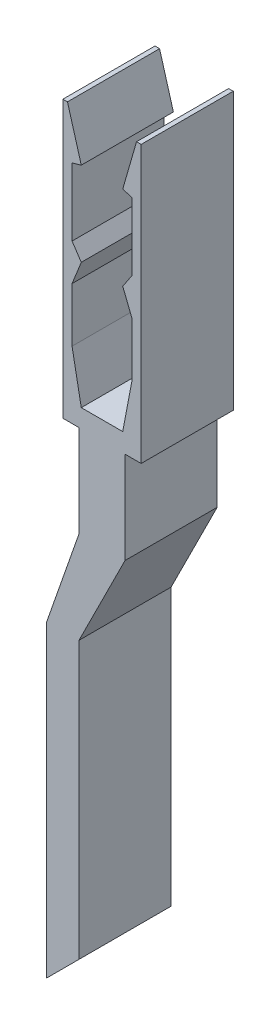
ISO-10303-21;
HEADER;
FILE_DESCRIPTION(('STEP AP214'),'2;1');
FILE_NAME('part.step','',(''),(''),'','','');
FILE_SCHEMA(('AUTOMOTIVE_DESIGN { 1 0 10303 214 1 1 1 1 }'));
ENDSEC;
DATA;
#1=APPLICATION_CONTEXT('core data for automotive mechanical design processes');
#2=APPLICATION_PROTOCOL_DEFINITION('international standard','automotive_design',2000,#1);
#3=PRODUCT_CONTEXT('',#1,'mechanical');
#4=PRODUCT('Part','Part','',(#3));
#5=PRODUCT_RELATED_PRODUCT_CATEGORY('part','',(#4));
#6=PRODUCT_DEFINITION_FORMATION('','',#4);
#7=PRODUCT_DEFINITION_CONTEXT('part definition',#1,'design');
#8=PRODUCT_DEFINITION('design','',#6,#7);
#9=PRODUCT_DEFINITION_SHAPE('','',#8);
#10=(LENGTH_UNIT() NAMED_UNIT(*) SI_UNIT(.MILLI.,.METRE.));
#11=(NAMED_UNIT(*) PLANE_ANGLE_UNIT() SI_UNIT($,.RADIAN.));
#12=(NAMED_UNIT(*) SI_UNIT($,.STERADIAN.) SOLID_ANGLE_UNIT());
#13=UNCERTAINTY_MEASURE_WITH_UNIT(LENGTH_MEASURE(1.E-05),#10,'distance_accuracy_value','');
#14=(GEOMETRIC_REPRESENTATION_CONTEXT(3) GLOBAL_UNCERTAINTY_ASSIGNED_CONTEXT((#13)) GLOBAL_UNIT_ASSIGNED_CONTEXT((#10,
#11,#12)) REPRESENTATION_CONTEXT('',''));
#15=CARTESIAN_POINT('',(0.,0.,0.));
#16=DIRECTION('',(0.,0.,1.));
#17=DIRECTION('',(1.,0.,0.));
#18=AXIS2_PLACEMENT_3D('',#15,#16,#17);
#19=CARTESIAN_POINT('',(0.85,-5.55,0.1));
#20=DIRECTION('',(0.,0.,-1.));
#21=DIRECTION('',(0.,-1.,0.));
#22=AXIS2_PLACEMENT_3D('',#19,#20,#21);
#23=PLANE('',#22);
#24=DIRECTION('',(-1.,0.,0.));
#25=VECTOR('',#24,1.);
#26=CARTESIAN_POINT('',(0.85,-0.2,0.1));
#27=LINE('',#26,#25);
#28=CARTESIAN_POINT('',(0.175,-0.2,0.1));
#29=VERTEX_POINT('',#28);
#30=CARTESIAN_POINT('',(0.,-0.2,0.1));
#31=VERTEX_POINT('',#30);
#32=EDGE_CURVE('E318',#29,#31,#27,.T.);
#33=ORIENTED_EDGE('',*,*,#32,.F.);
#34=DIRECTION('',(0.,1.,0.));
#35=VECTOR('',#34,1.);
#36=CARTESIAN_POINT('',(0.175,-1.2,0.1));
#37=LINE('',#36,#35);
#38=CARTESIAN_POINT('',(0.175,-1.2,0.1));
#39=VERTEX_POINT('',#38);
#40=EDGE_CURVE('E287',#39,#29,#37,.T.);
#41=ORIENTED_EDGE('',*,*,#40,.F.);
#42=DIRECTION('',(0.330350424728106,0.943858356366017,0.));
#43=VECTOR('',#42,1.);
#44=CARTESIAN_POINT('',(-1.10768374164811,-4.86481069042316,0.1));
#45=LINE('',#44,#43);
#46=CARTESIAN_POINT('',(-0.175,-2.2,0.1));
#47=VERTEX_POINT('',#46);
#48=EDGE_CURVE('E286',#47,#39,#45,.T.);
#49=ORIENTED_EDGE('',*,*,#48,.F.);
#50=DIRECTION('',(0.,1.,0.));
#51=VECTOR('',#50,1.);
#52=CARTESIAN_POINT('',(-0.175,-5.55,0.1));
#53=LINE('',#52,#51);
#54=CARTESIAN_POINT('',(-0.175,-5.55,0.1));
#55=VERTEX_POINT('',#54);
#56=EDGE_CURVE('E312',#55,#47,#53,.T.);
#57=ORIENTED_EDGE('',*,*,#56,.F.);
#58=DIRECTION('',(-0.707106781186547,-0.707106781186548,0.));
#59=VECTOR('',#58,1.);
#60=CARTESIAN_POINT('',(0.3375,-5.0375,0.1));
#61=LINE('',#60,#59);
#62=CARTESIAN_POINT('',(0.175,-5.2,0.1));
#63=VERTEX_POINT('',#62);
#64=EDGE_CURVE('E290',#63,#55,#61,.T.);
#65=ORIENTED_EDGE('',*,*,#64,.F.);
#66=DIRECTION('',(0.,-1.,0.));
#67=VECTOR('',#66,1.);
#68=CARTESIAN_POINT('',(0.175,-5.55,0.1));
#69=LINE('',#68,#67);
#70=CARTESIAN_POINT('',(0.175,-2.2,0.1));
#71=VERTEX_POINT('',#70);
#72=EDGE_CURVE('E242',#71,#63,#69,.T.);
#73=ORIENTED_EDGE('',*,*,#72,.F.);
#74=DIRECTION('',(-0.447213595499958,-0.894427190999916,0.));
#75=VECTOR('',#74,1.);
#76=CARTESIAN_POINT('',(-1.03,-4.61,0.1));
#77=LINE('',#76,#75);
#78=CARTESIAN_POINT('',(0.675,-1.2,0.1));
#79=VERTEX_POINT('',#78);
#80=EDGE_CURVE('E241',#79,#71,#77,.T.);
#81=ORIENTED_EDGE('',*,*,#80,.F.);
#82=DIRECTION('',(0.,1.,0.));
#83=VECTOR('',#82,1.);
#84=CARTESIAN_POINT('',(0.675,-5.55,0.1));
#85=LINE('',#84,#83);
#86=CARTESIAN_POINT('',(0.675,-0.2,0.1));
#87=VERTEX_POINT('',#86);
#88=EDGE_CURVE('E237',#79,#87,#85,.T.);
#89=ORIENTED_EDGE('',*,*,#88,.T.);
#90=DIRECTION('',(-1.,0.,0.));
#91=VECTOR('',#90,1.);
#92=CARTESIAN_POINT('',(0.85,-0.2,0.1));
#93=LINE('',#92,#91);
#94=CARTESIAN_POINT('',(0.85,-0.2,0.1));
#95=VERTEX_POINT('',#94);
#96=EDGE_CURVE('E323',#95,#87,#93,.T.);
#97=ORIENTED_EDGE('',*,*,#96,.F.);
#98=DIRECTION('',(0.,-1.,0.));
#99=VECTOR('',#98,1.);
#100=CARTESIAN_POINT('',(0.85,-5.55,0.1));
#101=LINE('',#100,#99);
#102=CARTESIAN_POINT('',(0.85,2.8,0.1));
#103=VERTEX_POINT('',#102);
#104=EDGE_CURVE('E334',#103,#95,#101,.T.);
#105=ORIENTED_EDGE('',*,*,#104,.F.);
#106=DIRECTION('',(1.,0.,0.));
#107=VECTOR('',#106,1.);
#108=CARTESIAN_POINT('',(0.85,2.8,0.1));
#109=LINE('',#108,#107);
#110=CARTESIAN_POINT('',(0.8,2.8,0.1));
#111=VERTEX_POINT('',#110);
#112=EDGE_CURVE('E348',#111,#103,#109,.T.);
#113=ORIENTED_EDGE('',*,*,#112,.F.);
#114=DIRECTION('',(0.276944772428183,0.960885837664757,0.));
#115=VECTOR('',#114,1.);
#116=CARTESIAN_POINT('',(-1.41820286515801,-4.89626268627418,0.1));
#117=LINE('',#116,#115);
#118=CARTESIAN_POINT('',(0.65,2.279560945,0.1));
#119=VERTEX_POINT('',#118);
#120=EDGE_CURVE('E282',#119,#111,#117,.T.);
#121=ORIENTED_EDGE('',*,*,#120,.F.);
#122=DIRECTION('',(-0.960885839024237,0.276944767711341,0.));
#123=VECTOR('',#122,1.);
#124=CARTESIAN_POINT('',(2.91820283314209,1.62582365256094,0.1));
#125=LINE('',#124,#123);
#126=CARTESIAN_POINT('',(0.75,2.250739127,0.1));
#127=VERTEX_POINT('',#126);
#128=EDGE_CURVE('E281',#127,#119,#125,.T.);
#129=ORIENTED_EDGE('',*,*,#128,.F.);
#130=DIRECTION('',(0.,1.,0.));
#131=VECTOR('',#130,1.);
#132=CARTESIAN_POINT('',(0.75,-5.55,0.1));
#133=LINE('',#132,#131);
#134=CARTESIAN_POINT('',(0.75,1.516264803,0.1));
#135=VERTEX_POINT('',#134);
#136=EDGE_CURVE('E681',#135,#127,#133,.T.);
#137=ORIENTED_EDGE('',*,*,#136,.F.);
#138=DIRECTION('',(0.55470019622523,0.832050294337843,0.));
#139=VECTOR('',#138,1.);
#140=CARTESIAN_POINT('',(-2.48058375523077,-3.32961082984615,0.1));
#141=LINE('',#140,#139);
#142=CARTESIAN_POINT('',(0.65,1.366264803,0.1));
#143=VERTEX_POINT('',#142);
#144=EDGE_CURVE('E343',#143,#135,#141,.T.);
#145=ORIENTED_EDGE('',*,*,#144,.F.);
#146=DIRECTION('',(-0.371390676354104,0.928476690885259,0.));
#147=VECTOR('',#146,1.);
#148=CARTESIAN_POINT('',(3.06250510448276,-4.6649979582069,0.1));
#149=LINE('',#148,#147);
#150=CARTESIAN_POINT('',(0.75,1.116264803,0.1));
#151=VERTEX_POINT('',#150);
#152=EDGE_CURVE('E272',#151,#143,#149,.T.);
#153=ORIENTED_EDGE('',*,*,#152,.F.);
#154=DIRECTION('',(0.,1.,0.));
#155=VECTOR('',#154,1.);
#156=CARTESIAN_POINT('',(0.75,-5.55,0.1));
#157=LINE('',#156,#155);
#158=CARTESIAN_POINT('',(0.75,0.527464379,0.1));
#159=VERTEX_POINT('',#158);
#160=EDGE_CURVE('E402',#159,#151,#157,.T.);
#161=ORIENTED_EDGE('',*,*,#160,.F.);
#162=DIRECTION('',(0.186268297140006,0.982498916783404,0.));
#163=VECTOR('',#162,1.);
#164=CARTESIAN_POINT('',(-0.358757445245965,-5.32083619418289,0.1));
#165=LINE('',#164,#163);
#166=CARTESIAN_POINT('',(0.65,0.,0.1));
#167=VERTEX_POINT('',#166);
#168=EDGE_CURVE('E295',#167,#159,#165,.T.);
#169=ORIENTED_EDGE('',*,*,#168,.F.);
#170=DIRECTION('',(-1.,0.,0.));
#171=VECTOR('',#170,1.);
#172=CARTESIAN_POINT('',(0.85,0.,0.1));
#173=LINE('',#172,#171);
#174=CARTESIAN_POINT('',(0.2,0.,0.1));
#175=VERTEX_POINT('',#174);
#176=EDGE_CURVE('E294',#167,#175,#173,.T.);
#177=ORIENTED_EDGE('',*,*,#176,.T.);
#178=DIRECTION('',(-0.186268297140006,0.982498916783404,0.));
#179=VECTOR('',#178,1.);
#180=CARTESIAN_POINT('',(1.23824894198749,-5.47639333432837,0.1));
#181=LINE('',#180,#179);
#182=CARTESIAN_POINT('',(0.1,0.527464379,0.1));
#183=VERTEX_POINT('',#182);
#184=EDGE_CURVE('E328',#175,#183,#181,.T.);
#185=ORIENTED_EDGE('',*,*,#184,.T.);
#186=DIRECTION('',(0.,1.,0.));
#187=VECTOR('',#186,1.);
#188=CARTESIAN_POINT('',(0.1,-5.55,0.1));
#189=LINE('',#188,#187);
#190=CARTESIAN_POINT('',(0.1,1.116264803,0.1));
#191=VERTEX_POINT('',#190);
#192=EDGE_CURVE('E360',#183,#191,#189,.T.);
#193=ORIENTED_EDGE('',*,*,#192,.T.);
#194=DIRECTION('',(0.371390676354104,0.928476690885259,0.));
#195=VECTOR('',#194,1.);
#196=CARTESIAN_POINT('',(-2.09526372517242,-4.37189450993104,0.1));
#197=LINE('',#196,#195);
#198=CARTESIAN_POINT('',(0.2,1.366264803,0.1));
#199=VERTEX_POINT('',#198);
#200=EDGE_CURVE('E359',#191,#199,#197,.T.);
#201=ORIENTED_EDGE('',*,*,#200,.T.);
#202=DIRECTION('',(-0.554700196225229,0.832050294337844,0.));
#203=VECTOR('',#202,1.);
#204=CARTESIAN_POINT('',(3.59212221676923,-3.72191852215384,0.1));
#205=LINE('',#204,#203);
#206=CARTESIAN_POINT('',(0.1,1.516264803,0.1));
#207=VERTEX_POINT('',#206);
#208=EDGE_CURVE('E358',#199,#207,#205,.T.);
#209=ORIENTED_EDGE('',*,*,#208,.T.);
#210=DIRECTION('',(0.,1.,0.));
#211=VECTOR('',#210,1.);
#212=CARTESIAN_POINT('',(0.1,-5.55,0.1));
#213=LINE('',#212,#211);
#214=CARTESIAN_POINT('',(0.1,2.250739127,0.1));
#215=VERTEX_POINT('',#214);
#216=EDGE_CURVE('E422',#207,#215,#213,.T.);
#217=ORIENTED_EDGE('',*,*,#216,.T.);
#218=DIRECTION('',(0.960885839024237,0.276944767711341,0.));
#219=VECTOR('',#218,1.);
#220=CARTESIAN_POINT('',(-1.28339647685037,1.85201911222377,0.1));
#221=LINE('',#220,#219);
#222=CARTESIAN_POINT('',(0.2,2.279560945,0.1));
#223=VERTEX_POINT('',#222);
#224=EDGE_CURVE('E369',#215,#223,#221,.T.);
#225=ORIENTED_EDGE('',*,*,#224,.T.);
#226=DIRECTION('',(-0.276944772428183,0.960885837664757,0.));
#227=VECTOR('',#226,1.);
#228=CARTESIAN_POINT('',(2.33339651108701,-5.12245814946949,0.1));
#229=LINE('',#228,#227);
#230=CARTESIAN_POINT('',(0.05,2.8,0.1));
#231=VERTEX_POINT('',#230);
#232=EDGE_CURVE('E335',#223,#231,#229,.T.);
#233=ORIENTED_EDGE('',*,*,#232,.T.);
#234=DIRECTION('',(-1.,0.,0.));
#235=VECTOR('',#234,1.);
#236=CARTESIAN_POINT('',(0.85,2.8,0.1));
#237=LINE('',#236,#235);
#238=CARTESIAN_POINT('',(0.,2.8,0.1));
#239=VERTEX_POINT('',#238);
#240=EDGE_CURVE('E27',#231,#239,#237,.T.);
#241=ORIENTED_EDGE('',*,*,#240,.T.);
#242=DIRECTION('',(0.,-1.,0.));
#243=VECTOR('',#242,1.);
#244=CARTESIAN_POINT('',(0.,-5.55,0.1));
#245=LINE('',#244,#243);
#246=EDGE_CURVE('E11',#239,#31,#245,.T.);
#247=ORIENTED_EDGE('',*,*,#246,.T.);
#248=EDGE_LOOP('',(#33,#41,#49,#57,#65,#73,#81,#89,#97,#105,#113,#121,#129,#137,#145,#153,#161,
#169,#177,#185,#193,#201,#209,#217,#225,#233,#241,#247));
#249=FACE_BOUND('',#248,.T.);
#250=ADVANCED_FACE('F16',(#249),#23,.F.);
#251=CARTESIAN_POINT('',(0.,-0.2,0.1));
#252=DIRECTION('',(1.,0.,0.));
#253=DIRECTION('',(0.,1.,0.));
#254=AXIS2_PLACEMENT_3D('',#251,#252,#253);
#255=PLANE('',#254);
#256=DIRECTION('',(0.,1.,0.));
#257=VECTOR('',#256,1.);
#258=CARTESIAN_POINT('',(0.,-0.2,-0.9));
#259=LINE('',#258,#257);
#260=CARTESIAN_POINT('',(0.,-0.2,-0.9));
#261=VERTEX_POINT('',#260);
#262=CARTESIAN_POINT('',(0.,2.8,-0.9));
#263=VERTEX_POINT('',#262);
#264=EDGE_CURVE('E301',#261,#263,#259,.T.);
#265=ORIENTED_EDGE('',*,*,#264,.F.);
#266=DIRECTION('',(0.,0.,-1.));
#267=VECTOR('',#266,1.);
#268=CARTESIAN_POINT('',(0.,-0.2,0.1));
#269=LINE('',#268,#267);
#270=EDGE_CURVE('E384',#31,#261,#269,.T.);
#271=ORIENTED_EDGE('',*,*,#270,.F.);
#272=ORIENTED_EDGE('',*,*,#246,.F.);
#273=DIRECTION('',(0.,0.,-1.));
#274=VECTOR('',#273,1.);
#275=CARTESIAN_POINT('',(0.,2.8,0.1));
#276=LINE('',#275,#274);
#277=EDGE_CURVE('E270',#239,#263,#276,.T.);
#278=ORIENTED_EDGE('',*,*,#277,.T.);
#279=EDGE_LOOP('',(#265,#271,#272,#278));
#280=FACE_BOUND('',#279,.T.);
#281=ADVANCED_FACE('F874',(#280),#255,.F.);
#282=CARTESIAN_POINT('',(0.,2.8,0.1));
#283=DIRECTION('',(0.,-1.,0.));
#284=DIRECTION('',(0.,0.,-1.));
#285=AXIS2_PLACEMENT_3D('',#282,#283,#284);
#286=PLANE('',#285);
#287=DIRECTION('',(1.,0.,0.));
#288=VECTOR('',#287,1.);
#289=CARTESIAN_POINT('',(0.,2.8,-0.9));
#290=LINE('',#289,#288);
#291=CARTESIAN_POINT('',(0.05,2.8,-0.9));
#292=VERTEX_POINT('',#291);
#293=EDGE_CURVE('E296',#263,#292,#290,.T.);
#294=ORIENTED_EDGE('',*,*,#293,.F.);
#295=ORIENTED_EDGE('',*,*,#277,.F.);
#296=ORIENTED_EDGE('',*,*,#240,.F.);
#297=DIRECTION('',(0.,0.,-1.));
#298=VECTOR('',#297,1.);
#299=CARTESIAN_POINT('',(0.05,2.8,0.1));
#300=LINE('',#299,#298);
#301=EDGE_CURVE('E339',#231,#292,#300,.T.);
#302=ORIENTED_EDGE('',*,*,#301,.T.);
#303=EDGE_LOOP('',(#294,#295,#296,#302));
#304=FACE_BOUND('',#303,.T.);
#305=ADVANCED_FACE('F503',(#304),#286,.F.);
#306=CARTESIAN_POINT('',(0.05,2.8,-0.9));
#307=DIRECTION('',(-0.960885837664757,-0.276944772428183,0.));
#308=DIRECTION('',(-0.276944772428183,0.960885837664757,0.));
#309=AXIS2_PLACEMENT_3D('',#306,#307,#308);
#310=PLANE('',#309);
#311=DIRECTION('',(0.276944772428183,-0.960885837664757,0.));
#312=VECTOR('',#311,1.);
#313=CARTESIAN_POINT('',(0.05,2.8,-0.9));
#314=LINE('',#313,#312);
#315=CARTESIAN_POINT('',(0.2,2.279560945,-0.9));
#316=VERTEX_POINT('',#315);
#317=EDGE_CURVE('E300',#292,#316,#314,.T.);
#318=ORIENTED_EDGE('',*,*,#317,.F.);
#319=ORIENTED_EDGE('',*,*,#301,.F.);
#320=ORIENTED_EDGE('',*,*,#232,.F.);
#321=DIRECTION('',(0.,0.,-1.));
#322=VECTOR('',#321,1.);
#323=CARTESIAN_POINT('',(0.2,2.279560945,-0.9));
#324=LINE('',#323,#322);
#325=EDGE_CURVE('E420',#223,#316,#324,.T.);
#326=ORIENTED_EDGE('',*,*,#325,.T.);
#327=EDGE_LOOP('',(#318,#319,#320,#326));
#328=FACE_BOUND('',#327,.T.);
#329=ADVANCED_FACE('F500',(#328),#310,.F.);
#330=CARTESIAN_POINT('',(0.2,2.279560945,-0.9));
#331=DIRECTION('',(-0.276944767711341,0.960885839024237,0.));
#332=DIRECTION('',(0.,0.,1.));
#333=AXIS2_PLACEMENT_3D('',#330,#331,#332);
#334=PLANE('',#333);
#335=DIRECTION('',(-0.960885839024237,-0.276944767711341,0.));
#336=VECTOR('',#335,1.);
#337=CARTESIAN_POINT('',(0.2,2.279560945,-0.9));
#338=LINE('',#337,#336);
#339=CARTESIAN_POINT('',(0.1,2.250739127,-0.9));
#340=VERTEX_POINT('',#339);
#341=EDGE_CURVE('E414',#316,#340,#338,.T.);
#342=ORIENTED_EDGE('',*,*,#341,.F.);
#343=ORIENTED_EDGE('',*,*,#325,.F.);
#344=ORIENTED_EDGE('',*,*,#224,.F.);
#345=DIRECTION('',(0.,0.,-1.));
#346=VECTOR('',#345,1.);
#347=CARTESIAN_POINT('',(0.1,2.250739127,-0.9));
#348=LINE('',#347,#346);
#349=EDGE_CURVE('E434',#215,#340,#348,.T.);
#350=ORIENTED_EDGE('',*,*,#349,.T.);
#351=EDGE_LOOP('',(#342,#343,#344,#350));
#352=FACE_BOUND('',#351,.T.);
#353=ADVANCED_FACE('F497',(#352),#334,.F.);
#354=CARTESIAN_POINT('',(0.1,2.250739127,-0.9));
#355=DIRECTION('',(-1.,0.,0.));
#356=DIRECTION('',(0.,0.,1.));
#357=AXIS2_PLACEMENT_3D('',#354,#355,#356);
#358=PLANE('',#357);
#359=DIRECTION('',(0.,-1.,0.));
#360=VECTOR('',#359,1.);
#361=CARTESIAN_POINT('',(0.1,2.250739127,-0.9));
#362=LINE('',#361,#360);
#363=CARTESIAN_POINT('',(0.1,1.516264803,-0.9));
#364=VERTEX_POINT('',#363);
#365=EDGE_CURVE('E20',#340,#364,#362,.T.);
#366=ORIENTED_EDGE('',*,*,#365,.F.);
#367=ORIENTED_EDGE('',*,*,#349,.F.);
#368=ORIENTED_EDGE('',*,*,#216,.F.);
#369=DIRECTION('',(0.,0.,-1.));
#370=VECTOR('',#369,1.);
#371=CARTESIAN_POINT('',(0.1,1.516264803,-0.9));
#372=LINE('',#371,#370);
#373=EDGE_CURVE('E355',#207,#364,#372,.T.);
#374=ORIENTED_EDGE('',*,*,#373,.T.);
#375=EDGE_LOOP('',(#366,#367,#368,#374));
#376=FACE_BOUND('',#375,.T.);
#377=ADVANCED_FACE('F491',(#376),#358,.F.);
#378=CARTESIAN_POINT('',(0.1,1.516264803,-0.9));
#379=DIRECTION('',(-0.832050294337844,-0.554700196225229,0.));
#380=DIRECTION('',(-0.554700196225229,0.832050294337844,0.));
#381=AXIS2_PLACEMENT_3D('',#378,#379,#380);
#382=PLANE('',#381);
#383=DIRECTION('',(0.554700196225229,-0.832050294337844,0.));
#384=VECTOR('',#383,1.);
#385=CARTESIAN_POINT('',(0.1,1.516264803,-0.9));
#386=LINE('',#385,#384);
#387=CARTESIAN_POINT('',(0.2,1.366264803,-0.9));
#388=VERTEX_POINT('',#387);
#389=EDGE_CURVE('E307',#364,#388,#386,.T.);
#390=ORIENTED_EDGE('',*,*,#389,.F.);
#391=ORIENTED_EDGE('',*,*,#373,.F.);
#392=ORIENTED_EDGE('',*,*,#208,.F.);
#393=DIRECTION('',(0.,0.,-1.));
#394=VECTOR('',#393,1.);
#395=CARTESIAN_POINT('',(0.2,1.366264803,-0.9));
#396=LINE('',#395,#394);
#397=EDGE_CURVE('E364',#199,#388,#396,.T.);
#398=ORIENTED_EDGE('',*,*,#397,.T.);
#399=EDGE_LOOP('',(#390,#391,#392,#398));
#400=FACE_BOUND('',#399,.T.);
#401=ADVANCED_FACE('F487',(#400),#382,.F.);
#402=CARTESIAN_POINT('',(0.2,1.366264803,-0.9));
#403=DIRECTION('',(-0.92847669088526,0.371390676354103,0.));
#404=DIRECTION('',(0.,0.,1.));
#405=AXIS2_PLACEMENT_3D('',#402,#403,#404);
#406=PLANE('',#405);
#407=DIRECTION('',(-0.371390676354104,-0.928476690885259,0.));
#408=VECTOR('',#407,1.);
#409=CARTESIAN_POINT('',(0.2,1.366264803,-0.9));
#410=LINE('',#409,#408);
#411=CARTESIAN_POINT('',(0.1,1.116264803,-0.9));
#412=VERTEX_POINT('',#411);
#413=EDGE_CURVE('E302',#388,#412,#410,.T.);
#414=ORIENTED_EDGE('',*,*,#413,.F.);
#415=ORIENTED_EDGE('',*,*,#397,.F.);
#416=ORIENTED_EDGE('',*,*,#200,.F.);
#417=DIRECTION('',(0.,0.,-1.));
#418=VECTOR('',#417,1.);
#419=CARTESIAN_POINT('',(0.1,1.116264803,-0.9));
#420=LINE('',#419,#418);
#421=EDGE_CURVE('E365',#191,#412,#420,.T.);
#422=ORIENTED_EDGE('',*,*,#421,.T.);
#423=EDGE_LOOP('',(#414,#415,#416,#422));
#424=FACE_BOUND('',#423,.T.);
#425=ADVANCED_FACE('F892',(#424),#406,.F.);
#426=CARTESIAN_POINT('',(0.1,1.116264803,-0.9));
#427=DIRECTION('',(-1.,0.,0.));
#428=DIRECTION('',(0.,0.,1.));
#429=AXIS2_PLACEMENT_3D('',#426,#427,#428);
#430=PLANE('',#429);
#431=DIRECTION('',(0.,-1.,0.));
#432=VECTOR('',#431,1.);
#433=CARTESIAN_POINT('',(0.1,1.116264803,-0.9));
#434=LINE('',#433,#432);
#435=CARTESIAN_POINT('',(0.1,0.527464379,-0.9));
#436=VERTEX_POINT('',#435);
#437=EDGE_CURVE('E306',#412,#436,#434,.T.);
#438=ORIENTED_EDGE('',*,*,#437,.F.);
#439=ORIENTED_EDGE('',*,*,#421,.F.);
#440=ORIENTED_EDGE('',*,*,#192,.F.);
#441=DIRECTION('',(0.,0.,-1.));
#442=VECTOR('',#441,1.);
#443=CARTESIAN_POINT('',(0.1,0.527464379,-0.9));
#444=LINE('',#443,#442);
#445=EDGE_CURVE('E325',#183,#436,#444,.T.);
#446=ORIENTED_EDGE('',*,*,#445,.T.);
#447=EDGE_LOOP('',(#438,#439,#440,#446));
#448=FACE_BOUND('',#447,.T.);
#449=ADVANCED_FACE('F866',(#448),#430,.F.);
#450=CARTESIAN_POINT('',(0.1,0.527464379,-0.9));
#451=DIRECTION('',(-0.982498916783404,-0.186268297140006,0.));
#452=DIRECTION('',(-0.186268297140006,0.982498916783404,0.));
#453=AXIS2_PLACEMENT_3D('',#450,#451,#452);
#454=PLANE('',#453);
#455=DIRECTION('',(0.186268297140006,-0.982498916783404,0.));
#456=VECTOR('',#455,1.);
#457=CARTESIAN_POINT('',(0.1,0.527464379,-0.9));
#458=LINE('',#457,#456);
#459=CARTESIAN_POINT('',(0.2,0.,-0.9));
#460=VERTEX_POINT('',#459);
#461=EDGE_CURVE('E467',#436,#460,#458,.T.);
#462=ORIENTED_EDGE('',*,*,#461,.F.);
#463=ORIENTED_EDGE('',*,*,#445,.F.);
#464=ORIENTED_EDGE('',*,*,#184,.F.);
#465=DIRECTION('',(0.,0.,-1.));
#466=VECTOR('',#465,1.);
#467=CARTESIAN_POINT('',(0.2,0.,0.1));
#468=LINE('',#467,#466);
#469=EDGE_CURVE('E291',#175,#460,#468,.T.);
#470=ORIENTED_EDGE('',*,*,#469,.T.);
#471=EDGE_LOOP('',(#462,#463,#464,#470));
#472=FACE_BOUND('',#471,.T.);
#473=ADVANCED_FACE('F18',(#472),#454,.F.);
#474=CARTESIAN_POINT('',(0.2,0.,0.1));
#475=DIRECTION('',(0.,-1.,0.));
#476=DIRECTION('',(0.,0.,-1.));
#477=AXIS2_PLACEMENT_3D('',#474,#475,#476);
#478=PLANE('',#477);
#479=DIRECTION('',(1.,0.,0.));
#480=VECTOR('',#479,1.);
#481=CARTESIAN_POINT('',(0.2,0.,-0.9));
#482=LINE('',#481,#480);
#483=CARTESIAN_POINT('',(0.65,0.,-0.9));
#484=VERTEX_POINT('',#483);
#485=EDGE_CURVE('E453',#460,#484,#482,.T.);
#486=ORIENTED_EDGE('',*,*,#485,.F.);
#487=ORIENTED_EDGE('',*,*,#469,.F.);
#488=ORIENTED_EDGE('',*,*,#176,.F.);
#489=DIRECTION('',(0.,0.,1.));
#490=VECTOR('',#489,1.);
#491=CARTESIAN_POINT('',(0.65,0.,-0.9));
#492=LINE('',#491,#490);
#493=EDGE_CURVE('E405',#484,#167,#492,.T.);
#494=ORIENTED_EDGE('',*,*,#493,.F.);
#495=EDGE_LOOP('',(#486,#487,#488,#494));
#496=FACE_BOUND('',#495,.T.);
#497=ADVANCED_FACE('F865',(#496),#478,.F.);
#498=CARTESIAN_POINT('',(0.75,0.527464379,-0.9));
#499=DIRECTION('',(-0.982498916783404,0.186268297140006,0.));
#500=DIRECTION('',(0.,0.,1.));
#501=AXIS2_PLACEMENT_3D('',#498,#499,#500);
#502=PLANE('',#501);
#503=ORIENTED_EDGE('',*,*,#493,.T.);
#504=ORIENTED_EDGE('',*,*,#168,.T.);
#505=DIRECTION('',(0.,0.,1.));
#506=VECTOR('',#505,1.);
#507=CARTESIAN_POINT('',(0.75,0.527464379,-0.9));
#508=LINE('',#507,#506);
#509=CARTESIAN_POINT('',(0.75,0.527464379,-0.9));
#510=VERTEX_POINT('',#509);
#511=EDGE_CURVE('E275',#510,#159,#508,.T.);
#512=ORIENTED_EDGE('',*,*,#511,.F.);
#513=DIRECTION('',(0.186268297140006,0.982498916783404,0.));
#514=VECTOR('',#513,1.);
#515=CARTESIAN_POINT('',(-0.358757445245965,-5.32083619418289,-0.9));
#516=LINE('',#515,#514);
#517=EDGE_CURVE('E449',#484,#510,#516,.T.);
#518=ORIENTED_EDGE('',*,*,#517,.F.);
#519=EDGE_LOOP('',(#503,#504,#512,#518));
#520=FACE_BOUND('',#519,.T.);
#521=ADVANCED_FACE('F948',(#520),#502,.T.);
#522=CARTESIAN_POINT('',(0.75,1.116264803,-0.9));
#523=DIRECTION('',(-1.,0.,0.));
#524=DIRECTION('',(0.,0.,1.));
#525=AXIS2_PLACEMENT_3D('',#522,#523,#524);
#526=PLANE('',#525);
#527=ORIENTED_EDGE('',*,*,#511,.T.);
#528=ORIENTED_EDGE('',*,*,#160,.T.);
#529=DIRECTION('',(0.,0.,1.));
#530=VECTOR('',#529,1.);
#531=CARTESIAN_POINT('',(0.75,1.116264803,-0.9));
#532=LINE('',#531,#530);
#533=CARTESIAN_POINT('',(0.75,1.116264803,-0.9));
#534=VERTEX_POINT('',#533);
#535=EDGE_CURVE('E276',#534,#151,#532,.T.);
#536=ORIENTED_EDGE('',*,*,#535,.F.);
#537=DIRECTION('',(0.,1.,0.));
#538=VECTOR('',#537,1.);
#539=CARTESIAN_POINT('',(0.75,-5.55,-0.9));
#540=LINE('',#539,#538);
#541=EDGE_CURVE('E452',#510,#534,#540,.T.);
#542=ORIENTED_EDGE('',*,*,#541,.F.);
#543=EDGE_LOOP('',(#527,#528,#536,#542));
#544=FACE_BOUND('',#543,.T.);
#545=ADVANCED_FACE('F939',(#544),#526,.T.);
#546=CARTESIAN_POINT('',(0.65,1.366264803,-0.9));
#547=DIRECTION('',(-0.928476690885259,-0.371390676354104,0.));
#548=DIRECTION('',(-0.371390676354104,0.928476690885259,0.));
#549=AXIS2_PLACEMENT_3D('',#546,#547,#548);
#550=PLANE('',#549);
#551=ORIENTED_EDGE('',*,*,#535,.T.);
#552=ORIENTED_EDGE('',*,*,#152,.T.);
#553=DIRECTION('',(0.,0.,1.));
#554=VECTOR('',#553,1.);
#555=CARTESIAN_POINT('',(0.65,1.366264803,-0.9));
#556=LINE('',#555,#554);
#557=CARTESIAN_POINT('',(0.65,1.366264803,-0.9));
#558=VERTEX_POINT('',#557);
#559=EDGE_CURVE('E602',#558,#143,#556,.T.);
#560=ORIENTED_EDGE('',*,*,#559,.F.);
#561=DIRECTION('',(-0.371390676354104,0.928476690885259,0.));
#562=VECTOR('',#561,1.);
#563=CARTESIAN_POINT('',(3.06250510448276,-4.6649979582069,-0.9));
#564=LINE('',#563,#562);
#565=EDGE_CURVE('E354',#534,#558,#564,.T.);
#566=ORIENTED_EDGE('',*,*,#565,.F.);
#567=EDGE_LOOP('',(#551,#552,#560,#566));
#568=FACE_BOUND('',#567,.T.);
#569=ADVANCED_FACE('F883',(#568),#550,.T.);
#570=CARTESIAN_POINT('',(0.75,1.516264803,-0.9));
#571=DIRECTION('',(-0.832050294337843,0.55470019622523,0.));
#572=DIRECTION('',(0.,0.,1.));
#573=AXIS2_PLACEMENT_3D('',#570,#571,#572);
#574=PLANE('',#573);
#575=ORIENTED_EDGE('',*,*,#559,.T.);
#576=ORIENTED_EDGE('',*,*,#144,.T.);
#577=DIRECTION('',(0.,0.,1.));
#578=VECTOR('',#577,1.);
#579=CARTESIAN_POINT('',(0.75,1.516264803,-0.9));
#580=LINE('',#579,#578);
#581=CARTESIAN_POINT('',(0.75,1.516264803,-0.9));
#582=VERTEX_POINT('',#581);
#583=EDGE_CURVE('E684',#582,#135,#580,.T.);
#584=ORIENTED_EDGE('',*,*,#583,.F.);
#585=DIRECTION('',(0.55470019622523,0.832050294337843,0.));
#586=VECTOR('',#585,1.);
#587=CARTESIAN_POINT('',(-2.48058375523077,-3.32961082984615,-0.9));
#588=LINE('',#587,#586);
#589=EDGE_CURVE('E349',#558,#582,#588,.T.);
#590=ORIENTED_EDGE('',*,*,#589,.F.);
#591=EDGE_LOOP('',(#575,#576,#584,#590));
#592=FACE_BOUND('',#591,.T.);
#593=ADVANCED_FACE('F878',(#592),#574,.T.);
#594=CARTESIAN_POINT('',(0.75,2.250739127,-0.9));
#595=DIRECTION('',(-1.,0.,0.));
#596=DIRECTION('',(0.,0.,1.));
#597=AXIS2_PLACEMENT_3D('',#594,#595,#596);
#598=PLANE('',#597);
#599=ORIENTED_EDGE('',*,*,#583,.T.);
#600=ORIENTED_EDGE('',*,*,#136,.T.);
#601=DIRECTION('',(0.,0.,1.));
#602=VECTOR('',#601,1.);
#603=CARTESIAN_POINT('',(0.75,2.250739127,-0.9));
#604=LINE('',#603,#602);
#605=CARTESIAN_POINT('',(0.75,2.250739127,-0.9));
#606=VERTEX_POINT('',#605);
#607=EDGE_CURVE('E277',#606,#127,#604,.T.);
#608=ORIENTED_EDGE('',*,*,#607,.F.);
#609=DIRECTION('',(0.,1.,0.));
#610=VECTOR('',#609,1.);
#611=CARTESIAN_POINT('',(0.75,-5.55,-0.9));
#612=LINE('',#611,#610);
#613=EDGE_CURVE('E353',#582,#606,#612,.T.);
#614=ORIENTED_EDGE('',*,*,#613,.F.);
#615=EDGE_LOOP('',(#599,#600,#608,#614));
#616=FACE_BOUND('',#615,.T.);
#617=ADVANCED_FACE('F882',(#616),#598,.T.);
#618=CARTESIAN_POINT('',(0.65,2.279560945,-0.9));
#619=DIRECTION('',(-0.276944767711341,-0.960885839024237,0.));
#620=DIRECTION('',(-0.960885839024237,0.276944767711341,0.));
#621=AXIS2_PLACEMENT_3D('',#618,#619,#620);
#622=PLANE('',#621);
#623=ORIENTED_EDGE('',*,*,#607,.T.);
#624=ORIENTED_EDGE('',*,*,#128,.T.);
#625=DIRECTION('',(0.,0.,1.));
#626=VECTOR('',#625,1.);
#627=CARTESIAN_POINT('',(0.65,2.279560945,-0.9));
#628=LINE('',#627,#626);
#629=CARTESIAN_POINT('',(0.65,2.279560945,-0.9));
#630=VERTEX_POINT('',#629);
#631=EDGE_CURVE('E344',#630,#119,#628,.T.);
#632=ORIENTED_EDGE('',*,*,#631,.F.);
#633=DIRECTION('',(-0.960885839024237,0.276944767711341,0.));
#634=VECTOR('',#633,1.);
#635=CARTESIAN_POINT('',(2.91820283314209,1.62582365256094,-0.9));
#636=LINE('',#635,#634);
#637=EDGE_CURVE('E419',#606,#630,#636,.T.);
#638=ORIENTED_EDGE('',*,*,#637,.F.);
#639=EDGE_LOOP('',(#623,#624,#632,#638));
#640=FACE_BOUND('',#639,.T.);
#641=ADVANCED_FACE('F915',(#640),#622,.T.);
#642=CARTESIAN_POINT('',(0.8,2.8,-0.9));
#643=DIRECTION('',(-0.960885837664757,0.276944772428183,0.));
#644=DIRECTION('',(0.,0.,1.));
#645=AXIS2_PLACEMENT_3D('',#642,#643,#644);
#646=PLANE('',#645);
#647=ORIENTED_EDGE('',*,*,#631,.T.);
#648=ORIENTED_EDGE('',*,*,#120,.T.);
#649=DIRECTION('',(0.,0.,1.));
#650=VECTOR('',#649,1.);
#651=CARTESIAN_POINT('',(0.8,2.8,-0.9));
#652=LINE('',#651,#650);
#653=CARTESIAN_POINT('',(0.8,2.8,-0.9));
#654=VERTEX_POINT('',#653);
#655=EDGE_CURVE('E333',#654,#111,#652,.T.);
#656=ORIENTED_EDGE('',*,*,#655,.F.);
#657=DIRECTION('',(0.276944772428183,0.960885837664757,0.));
#658=VECTOR('',#657,1.);
#659=CARTESIAN_POINT('',(-1.41820286515801,-4.89626268627418,-0.9));
#660=LINE('',#659,#658);
#661=EDGE_CURVE('E415',#630,#654,#660,.T.);
#662=ORIENTED_EDGE('',*,*,#661,.F.);
#663=EDGE_LOOP('',(#647,#648,#656,#662));
#664=FACE_BOUND('',#663,.T.);
#665=ADVANCED_FACE('F954',(#664),#646,.T.);
#666=CARTESIAN_POINT('',(0.8,2.8,-0.9));
#667=DIRECTION('',(0.,1.,0.));
#668=DIRECTION('',(1.,0.,0.));
#669=AXIS2_PLACEMENT_3D('',#666,#667,#668);
#670=PLANE('',#669);
#671=ORIENTED_EDGE('',*,*,#655,.T.);
#672=ORIENTED_EDGE('',*,*,#112,.T.);
#673=DIRECTION('',(0.,0.,1.));
#674=VECTOR('',#673,1.);
#675=CARTESIAN_POINT('',(0.85,2.8,0.1));
#676=LINE('',#675,#674);
#677=CARTESIAN_POINT('',(0.85,2.8,-0.9));
#678=VERTEX_POINT('',#677);
#679=EDGE_CURVE('E329',#678,#103,#676,.T.);
#680=ORIENTED_EDGE('',*,*,#679,.F.);
#681=DIRECTION('',(1.,0.,0.));
#682=VECTOR('',#681,1.);
#683=CARTESIAN_POINT('',(0.85,2.8,-0.9));
#684=LINE('',#683,#682);
#685=EDGE_CURVE('E418',#654,#678,#684,.T.);
#686=ORIENTED_EDGE('',*,*,#685,.F.);
#687=EDGE_LOOP('',(#671,#672,#680,#686));
#688=FACE_BOUND('',#687,.T.);
#689=ADVANCED_FACE('F958',(#688),#670,.T.);
#690=CARTESIAN_POINT('',(0.85,-0.2,0.1));
#691=DIRECTION('',(1.,0.,0.));
#692=DIRECTION('',(0.,1.,0.));
#693=AXIS2_PLACEMENT_3D('',#690,#691,#692);
#694=PLANE('',#693);
#695=ORIENTED_EDGE('',*,*,#104,.T.);
#696=DIRECTION('',(0.,0.,1.));
#697=VECTOR('',#696,1.);
#698=CARTESIAN_POINT('',(0.85,-0.2,0.1));
#699=LINE('',#698,#697);
#700=CARTESIAN_POINT('',(0.85,-0.2,-0.9));
#701=VERTEX_POINT('',#700);
#702=EDGE_CURVE('E319',#701,#95,#699,.T.);
#703=ORIENTED_EDGE('',*,*,#702,.F.);
#704=DIRECTION('',(0.,-1.,0.));
#705=VECTOR('',#704,1.);
#706=CARTESIAN_POINT('',(0.85,-5.55,-0.9));
#707=LINE('',#706,#705);
#708=EDGE_CURVE('E266',#678,#701,#707,.T.);
#709=ORIENTED_EDGE('',*,*,#708,.F.);
#710=ORIENTED_EDGE('',*,*,#679,.T.);
#711=EDGE_LOOP('',(#695,#703,#709,#710));
#712=FACE_BOUND('',#711,.T.);
#713=ADVANCED_FACE('F1011',(#712),#694,.T.);
#714=CARTESIAN_POINT('',(0.675,-0.2,0.1));
#715=DIRECTION('',(0.,-1.,0.));
#716=DIRECTION('',(0.,0.,-1.));
#717=AXIS2_PLACEMENT_3D('',#714,#715,#716);
#718=PLANE('',#717);
#719=ORIENTED_EDGE('',*,*,#702,.T.);
#720=ORIENTED_EDGE('',*,*,#96,.T.);
#721=DIRECTION('',(0.,0.,-1.));
#722=VECTOR('',#721,1.);
#723=CARTESIAN_POINT('',(0.675,-0.2,0.1));
#724=LINE('',#723,#722);
#725=CARTESIAN_POINT('',(0.675,-0.2,-0.9));
#726=VERTEX_POINT('',#725);
#727=EDGE_CURVE('E324',#87,#726,#724,.T.);
#728=ORIENTED_EDGE('',*,*,#727,.T.);
#729=DIRECTION('',(-1.,0.,0.));
#730=VECTOR('',#729,1.);
#731=CARTESIAN_POINT('',(0.85,-0.2,-0.9));
#732=LINE('',#731,#730);
#733=EDGE_CURVE('E258',#701,#726,#732,.T.);
#734=ORIENTED_EDGE('',*,*,#733,.F.);
#735=EDGE_LOOP('',(#719,#720,#728,#734));
#736=FACE_BOUND('',#735,.T.);
#737=ADVANCED_FACE('F1015',(#736),#718,.T.);
#738=CARTESIAN_POINT('',(0.675,-1.2,-0.9));
#739=DIRECTION('',(-1.,0.,0.));
#740=DIRECTION('',(0.,0.,1.));
#741=AXIS2_PLACEMENT_3D('',#738,#739,#740);
#742=PLANE('',#741);
#743=ORIENTED_EDGE('',*,*,#88,.F.);
#744=DIRECTION('',(0.,0.,1.));
#745=VECTOR('',#744,1.);
#746=CARTESIAN_POINT('',(0.675,-1.2,-0.9));
#747=LINE('',#746,#745);
#748=CARTESIAN_POINT('',(0.675,-1.2,-0.9));
#749=VERTEX_POINT('',#748);
#750=EDGE_CURVE('E229',#749,#79,#747,.T.);
#751=ORIENTED_EDGE('',*,*,#750,.F.);
#752=DIRECTION('',(0.,-1.,0.));
#753=VECTOR('',#752,1.);
#754=CARTESIAN_POINT('',(0.675,-1.2,-0.9));
#755=LINE('',#754,#753);
#756=EDGE_CURVE('E234',#726,#749,#755,.T.);
#757=ORIENTED_EDGE('',*,*,#756,.F.);
#758=ORIENTED_EDGE('',*,*,#727,.F.);
#759=EDGE_LOOP('',(#743,#751,#757,#758));
#760=FACE_BOUND('',#759,.T.);
#761=ADVANCED_FACE('F231',(#760),#742,.F.);
#762=CARTESIAN_POINT('',(0.175,-2.2,-0.9));
#763=DIRECTION('',(0.894427190999916,-0.447213595499958,0.));
#764=DIRECTION('',(0.,0.,-1.));
#765=AXIS2_PLACEMENT_3D('',#762,#763,#764);
#766=PLANE('',#765);
#767=DIRECTION('',(-0.447213595499958,-0.894427190999916,0.));
#768=VECTOR('',#767,1.);
#769=CARTESIAN_POINT('',(-1.03,-4.61,-0.9));
#770=LINE('',#769,#768);
#771=CARTESIAN_POINT('',(0.175,-2.2,-0.9));
#772=VERTEX_POINT('',#771);
#773=EDGE_CURVE('E245',#749,#772,#770,.T.);
#774=ORIENTED_EDGE('',*,*,#773,.F.);
#775=ORIENTED_EDGE('',*,*,#750,.T.);
#776=ORIENTED_EDGE('',*,*,#80,.T.);
#777=DIRECTION('',(0.,0.,1.));
#778=VECTOR('',#777,1.);
#779=CARTESIAN_POINT('',(0.175,-2.2,-0.9));
#780=LINE('',#779,#778);
#781=EDGE_CURVE('E248',#772,#71,#780,.T.);
#782=ORIENTED_EDGE('',*,*,#781,.F.);
#783=EDGE_LOOP('',(#774,#775,#776,#782));
#784=FACE_BOUND('',#783,.T.);
#785=ADVANCED_FACE('F246',(#784),#766,.T.);
#786=CARTESIAN_POINT('',(0.175,-5.2,0.1));
#787=DIRECTION('',(1.,0.,0.));
#788=DIRECTION('',(0.,1.,0.));
#789=AXIS2_PLACEMENT_3D('',#786,#787,#788);
#790=PLANE('',#789);
#791=DIRECTION('',(0.,-1.,0.));
#792=VECTOR('',#791,1.);
#793=CARTESIAN_POINT('',(0.175,-5.55,-0.9));
#794=LINE('',#793,#792);
#795=CARTESIAN_POINT('',(0.175,-5.2,-0.9));
#796=VERTEX_POINT('',#795);
#797=EDGE_CURVE('E253',#772,#796,#794,.T.);
#798=ORIENTED_EDGE('',*,*,#797,.F.);
#799=ORIENTED_EDGE('',*,*,#781,.T.);
#800=ORIENTED_EDGE('',*,*,#72,.T.);
#801=DIRECTION('',(0.,0.,1.));
#802=VECTOR('',#801,1.);
#803=CARTESIAN_POINT('',(0.175,-5.2,-0.9));
#804=LINE('',#803,#802);
#805=EDGE_CURVE('E571',#796,#63,#804,.T.);
#806=ORIENTED_EDGE('',*,*,#805,.F.);
#807=EDGE_LOOP('',(#798,#799,#800,#806));
#808=FACE_BOUND('',#807,.T.);
#809=ADVANCED_FACE('F996',(#808),#790,.T.);
#810=CARTESIAN_POINT('',(-0.175,-5.55,-0.9));
#811=DIRECTION('',(0.707106781186548,-0.707106781186547,0.));
#812=DIRECTION('',(0.,0.,-1.));
#813=AXIS2_PLACEMENT_3D('',#810,#811,#812);
#814=PLANE('',#813);
#815=DIRECTION('',(-0.707106781186547,-0.707106781186548,0.));
#816=VECTOR('',#815,1.);
#817=CARTESIAN_POINT('',(0.3375,-5.0375,-0.9));
#818=LINE('',#817,#816);
#819=CARTESIAN_POINT('',(-0.175,-5.55,-0.9));
#820=VERTEX_POINT('',#819);
#821=EDGE_CURVE('E394',#796,#820,#818,.T.);
#822=ORIENTED_EDGE('',*,*,#821,.F.);
#823=ORIENTED_EDGE('',*,*,#805,.T.);
#824=ORIENTED_EDGE('',*,*,#64,.T.);
#825=DIRECTION('',(0.,0.,1.));
#826=VECTOR('',#825,1.);
#827=CARTESIAN_POINT('',(-0.175,-5.55,-0.9));
#828=LINE('',#827,#826);
#829=EDGE_CURVE('E308',#820,#55,#828,.T.);
#830=ORIENTED_EDGE('',*,*,#829,.F.);
#831=EDGE_LOOP('',(#822,#823,#824,#830));
#832=FACE_BOUND('',#831,.T.);
#833=ADVANCED_FACE('F1039',(#832),#814,.T.);
#834=CARTESIAN_POINT('',(-0.175,-5.55,-0.9));
#835=DIRECTION('',(-1.,0.,0.));
#836=DIRECTION('',(0.,0.,1.));
#837=AXIS2_PLACEMENT_3D('',#834,#835,#836);
#838=PLANE('',#837);
#839=DIRECTION('',(0.,1.,0.));
#840=VECTOR('',#839,1.);
#841=CARTESIAN_POINT('',(-0.175,-5.55,-0.9));
#842=LINE('',#841,#840);
#843=CARTESIAN_POINT('',(-0.175,-2.2,-0.9));
#844=VERTEX_POINT('',#843);
#845=EDGE_CURVE('E398',#820,#844,#842,.T.);
#846=ORIENTED_EDGE('',*,*,#845,.F.);
#847=ORIENTED_EDGE('',*,*,#829,.T.);
#848=ORIENTED_EDGE('',*,*,#56,.T.);
#849=DIRECTION('',(0.,0.,1.));
#850=VECTOR('',#849,1.);
#851=CARTESIAN_POINT('',(-0.175,-2.2,-0.9));
#852=LINE('',#851,#850);
#853=EDGE_CURVE('E283',#844,#47,#852,.T.);
#854=ORIENTED_EDGE('',*,*,#853,.F.);
#855=EDGE_LOOP('',(#846,#847,#848,#854));
#856=FACE_BOUND('',#855,.T.);
#857=ADVANCED_FACE('F1005',(#856),#838,.T.);
#858=CARTESIAN_POINT('',(0.175,-1.2,-0.9));
#859=DIRECTION('',(-0.943858356366017,0.330350424728106,0.));
#860=DIRECTION('',(0.,0.,1.));
#861=AXIS2_PLACEMENT_3D('',#858,#859,#860);
#862=PLANE('',#861);
#863=DIRECTION('',(0.330350424728106,0.943858356366017,0.));
#864=VECTOR('',#863,1.);
#865=CARTESIAN_POINT('',(-1.10768374164811,-4.86481069042316,-0.9));
#866=LINE('',#865,#864);
#867=CARTESIAN_POINT('',(0.175,-1.2,-0.9));
#868=VERTEX_POINT('',#867);
#869=EDGE_CURVE('E524',#844,#868,#866,.T.);
#870=ORIENTED_EDGE('',*,*,#869,.F.);
#871=ORIENTED_EDGE('',*,*,#853,.T.);
#872=ORIENTED_EDGE('',*,*,#48,.T.);
#873=DIRECTION('',(0.,0.,-1.));
#874=VECTOR('',#873,1.);
#875=CARTESIAN_POINT('',(0.175,-1.2,-0.9));
#876=LINE('',#875,#874);
#877=EDGE_CURVE('E410',#39,#868,#876,.T.);
#878=ORIENTED_EDGE('',*,*,#877,.T.);
#879=EDGE_LOOP('',(#870,#871,#872,#878));
#880=FACE_BOUND('',#879,.T.);
#881=ADVANCED_FACE('F1001',(#880),#862,.T.);
#882=CARTESIAN_POINT('',(0.175,-1.2,0.1));
#883=DIRECTION('',(1.,0.,0.));
#884=DIRECTION('',(0.,1.,0.));
#885=AXIS2_PLACEMENT_3D('',#882,#883,#884);
#886=PLANE('',#885);
#887=DIRECTION('',(0.,1.,0.));
#888=VECTOR('',#887,1.);
#889=CARTESIAN_POINT('',(0.175,-1.2,-0.9));
#890=LINE('',#889,#888);
#891=CARTESIAN_POINT('',(0.175,-0.2,-0.9));
#892=VERTEX_POINT('',#891);
#893=EDGE_CURVE('E315',#868,#892,#890,.T.);
#894=ORIENTED_EDGE('',*,*,#893,.F.);
#895=ORIENTED_EDGE('',*,*,#877,.F.);
#896=ORIENTED_EDGE('',*,*,#40,.T.);
#897=DIRECTION('',(0.,0.,1.));
#898=VECTOR('',#897,1.);
#899=CARTESIAN_POINT('',(0.175,-0.2,0.1));
#900=LINE('',#899,#898);
#901=EDGE_CURVE('E370',#892,#29,#900,.T.);
#902=ORIENTED_EDGE('',*,*,#901,.F.);
#903=EDGE_LOOP('',(#894,#895,#896,#902));
#904=FACE_BOUND('',#903,.T.);
#905=ADVANCED_FACE('F967',(#904),#886,.F.);
#906=CARTESIAN_POINT('',(0.85,-5.55,-0.9));
#907=DIRECTION('',(0.,0.,-1.));
#908=DIRECTION('',(0.,-1.,0.));
#909=AXIS2_PLACEMENT_3D('',#906,#907,#908);
#910=PLANE('',#909);
#911=ORIENTED_EDGE('',*,*,#893,.T.);
#912=DIRECTION('',(1.,0.,0.));
#913=VECTOR('',#912,1.);
#914=CARTESIAN_POINT('',(0.,-0.2,-0.9));
#915=LINE('',#914,#913);
#916=EDGE_CURVE('E373',#261,#892,#915,.T.);
#917=ORIENTED_EDGE('',*,*,#916,.F.);
#918=ORIENTED_EDGE('',*,*,#264,.T.);
#919=ORIENTED_EDGE('',*,*,#293,.T.);
#920=ORIENTED_EDGE('',*,*,#317,.T.);
#921=ORIENTED_EDGE('',*,*,#341,.T.);
#922=ORIENTED_EDGE('',*,*,#365,.T.);
#923=ORIENTED_EDGE('',*,*,#389,.T.);
#924=ORIENTED_EDGE('',*,*,#413,.T.);
#925=ORIENTED_EDGE('',*,*,#437,.T.);
#926=ORIENTED_EDGE('',*,*,#461,.T.);
#927=ORIENTED_EDGE('',*,*,#485,.T.);
#928=ORIENTED_EDGE('',*,*,#517,.T.);
#929=ORIENTED_EDGE('',*,*,#541,.T.);
#930=ORIENTED_EDGE('',*,*,#565,.T.);
#931=ORIENTED_EDGE('',*,*,#589,.T.);
#932=ORIENTED_EDGE('',*,*,#613,.T.);
#933=ORIENTED_EDGE('',*,*,#637,.T.);
#934=ORIENTED_EDGE('',*,*,#661,.T.);
#935=ORIENTED_EDGE('',*,*,#685,.T.);
#936=ORIENTED_EDGE('',*,*,#708,.T.);
#937=ORIENTED_EDGE('',*,*,#733,.T.);
#938=ORIENTED_EDGE('',*,*,#756,.T.);
#939=ORIENTED_EDGE('',*,*,#773,.T.);
#940=ORIENTED_EDGE('',*,*,#797,.T.);
#941=ORIENTED_EDGE('',*,*,#821,.T.);
#942=ORIENTED_EDGE('',*,*,#845,.T.);
#943=ORIENTED_EDGE('',*,*,#869,.T.);
#944=EDGE_LOOP('',(#911,#917,#918,#919,#920,#921,#922,#923,#924,#925,#926,#927,#928,#929,#930,
#931,#932,#933,#934,#935,#936,#937,#938,#939,#940,#941,#942,#943));
#945=FACE_BOUND('',#944,.T.);
#946=ADVANCED_FACE('F255',(#945),#910,.T.);
#947=CARTESIAN_POINT('',(0.,-0.2,0.1));
#948=DIRECTION('',(0.,-1.,0.));
#949=DIRECTION('',(0.,0.,-1.));
#950=AXIS2_PLACEMENT_3D('',#947,#948,#949);
#951=PLANE('',#950);
#952=ORIENTED_EDGE('',*,*,#270,.T.);
#953=ORIENTED_EDGE('',*,*,#916,.T.);
#954=ORIENTED_EDGE('',*,*,#901,.T.);
#955=ORIENTED_EDGE('',*,*,#32,.T.);
#956=EDGE_LOOP('',(#952,#953,#954,#955));
#957=FACE_BOUND('',#956,.T.);
#958=ADVANCED_FACE('F921',(#957),#951,.T.);
#959=CLOSED_SHELL('',(#250,#281,#305,#329,#353,#377,#401,#425,#449,#473,#497,#521,#545,#569,
#593,#617,#641,#665,#689,#713,#737,#761,#785,#809,#833,#857,#881,#905,#946,#958));
#960=MANIFOLD_SOLID_BREP('B1',#959);
#961=ADVANCED_BREP_SHAPE_REPRESENTATION('',(#18,#960),#14);
#962=SHAPE_DEFINITION_REPRESENTATION(#9,#961);
ENDSEC;
END-ISO-10303-21;
